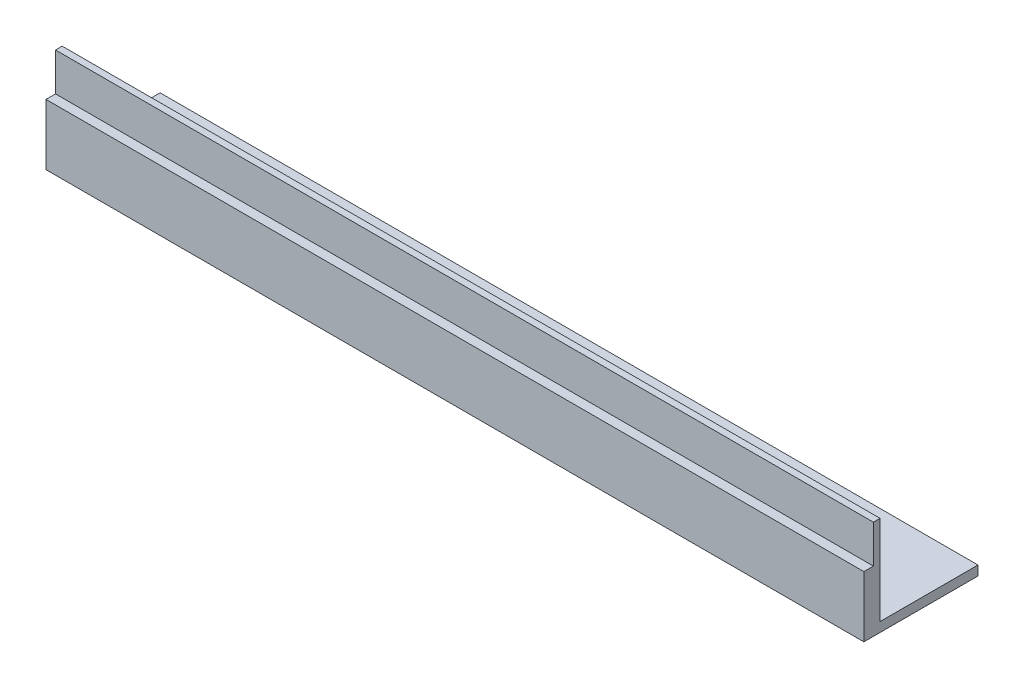
ISO-10303-21;
HEADER;
FILE_DESCRIPTION(('STEP AP214'),'2;1');
FILE_NAME('part.step','',(''),(''),'','','');
FILE_SCHEMA(('AUTOMOTIVE_DESIGN { 1 0 10303 214 1 1 1 1 }'));
ENDSEC;
DATA;
#1=APPLICATION_CONTEXT('core data for automotive mechanical design processes');
#2=APPLICATION_PROTOCOL_DEFINITION('international standard','automotive_design',2000,#1);
#3=PRODUCT_CONTEXT('',#1,'mechanical');
#4=PRODUCT('Part','Part','',(#3));
#5=PRODUCT_RELATED_PRODUCT_CATEGORY('part','',(#4));
#6=PRODUCT_DEFINITION_FORMATION('','',#4);
#7=PRODUCT_DEFINITION_CONTEXT('part definition',#1,'design');
#8=PRODUCT_DEFINITION('design','',#6,#7);
#9=PRODUCT_DEFINITION_SHAPE('','',#8);
#10=(LENGTH_UNIT() NAMED_UNIT(*) SI_UNIT(.MILLI.,.METRE.));
#11=(NAMED_UNIT(*) PLANE_ANGLE_UNIT() SI_UNIT($,.RADIAN.));
#12=(NAMED_UNIT(*) SI_UNIT($,.STERADIAN.) SOLID_ANGLE_UNIT());
#13=UNCERTAINTY_MEASURE_WITH_UNIT(LENGTH_MEASURE(1.E-05),#10,'distance_accuracy_value','');
#14=(GEOMETRIC_REPRESENTATION_CONTEXT(3) GLOBAL_UNCERTAINTY_ASSIGNED_CONTEXT((#13)) GLOBAL_UNIT_ASSIGNED_CONTEXT((#10,
#11,#12)) REPRESENTATION_CONTEXT('',''));
#15=CARTESIAN_POINT('',(0.,0.,0.));
#16=DIRECTION('',(0.,0.,1.));
#17=DIRECTION('',(1.,0.,0.));
#18=AXIS2_PLACEMENT_3D('',#15,#16,#17);
#19=CARTESIAN_POINT('',(215.,-14.25,0.));
#20=DIRECTION('',(0.,1.,0.));
#21=DIRECTION('',(0.,0.,1.));
#22=AXIS2_PLACEMENT_3D('',#19,#20,#21);
#23=PLANE('',#22);
#24=DIRECTION('',(0.,0.,-1.));
#25=VECTOR('',#24,1.);
#26=CARTESIAN_POINT('',(0.,-14.25,0.));
#27=LINE('',#26,#25);
#28=CARTESIAN_POINT('',(0.,-14.25,30.));
#29=VERTEX_POINT('',#28);
#30=CARTESIAN_POINT('',(0.,-14.25,0.));
#31=VERTEX_POINT('',#30);
#32=EDGE_CURVE('E135',#29,#31,#27,.T.);
#33=ORIENTED_EDGE('',*,*,#32,.T.);
#34=DIRECTION('',(-1.,0.,0.));
#35=VECTOR('',#34,1.);
#36=CARTESIAN_POINT('',(215.,-14.25,0.));
#37=LINE('',#36,#35);
#38=CARTESIAN_POINT('',(215.,-14.25,0.));
#39=VERTEX_POINT('',#38);
#40=EDGE_CURVE('E11',#39,#31,#37,.T.);
#41=ORIENTED_EDGE('',*,*,#40,.F.);
#42=DIRECTION('',(0.,0.,-1.));
#43=VECTOR('',#42,1.);
#44=CARTESIAN_POINT('',(215.,-14.25,0.));
#45=LINE('',#44,#43);
#46=CARTESIAN_POINT('',(215.,-14.25,30.));
#47=VERTEX_POINT('',#46);
#48=EDGE_CURVE('E155',#47,#39,#45,.T.);
#49=ORIENTED_EDGE('',*,*,#48,.F.);
#50=DIRECTION('',(-1.,0.,0.));
#51=VECTOR('',#50,1.);
#52=CARTESIAN_POINT('',(215.,-14.25,30.));
#53=LINE('',#52,#51);
#54=EDGE_CURVE('E55',#47,#29,#53,.T.);
#55=ORIENTED_EDGE('',*,*,#54,.T.);
#56=EDGE_LOOP('',(#33,#41,#49,#55));
#57=FACE_BOUND('',#56,.T.);
#58=ADVANCED_FACE('F39',(#57),#23,.F.);
#59=CARTESIAN_POINT('',(215.,0.,0.));
#60=DIRECTION('',(0.,0.,1.));
#61=DIRECTION('',(1.,0.,0.));
#62=AXIS2_PLACEMENT_3D('',#59,#60,#61);
#63=PLANE('',#62);
#64=DIRECTION('',(0.,1.,0.));
#65=VECTOR('',#64,1.);
#66=CARTESIAN_POINT('',(0.,0.,0.));
#67=LINE('',#66,#65);
#68=CARTESIAN_POINT('',(0.,-11.75,0.));
#69=VERTEX_POINT('',#68);
#70=EDGE_CURVE('E137',#31,#69,#67,.T.);
#71=ORIENTED_EDGE('',*,*,#70,.T.);
#72=DIRECTION('',(-1.,0.,0.));
#73=VECTOR('',#72,1.);
#74=CARTESIAN_POINT('',(215.,-11.75,0.));
#75=LINE('',#74,#73);
#76=CARTESIAN_POINT('',(215.,-11.75,0.));
#77=VERTEX_POINT('',#76);
#78=EDGE_CURVE('E47',#77,#69,#75,.T.);
#79=ORIENTED_EDGE('',*,*,#78,.F.);
#80=DIRECTION('',(0.,1.,0.));
#81=VECTOR('',#80,1.);
#82=CARTESIAN_POINT('',(215.,0.,0.));
#83=LINE('',#82,#81);
#84=EDGE_CURVE('E93',#39,#77,#83,.T.);
#85=ORIENTED_EDGE('',*,*,#84,.F.);
#86=ORIENTED_EDGE('',*,*,#40,.T.);
#87=EDGE_LOOP('',(#71,#79,#85,#86));
#88=FACE_BOUND('',#87,.T.);
#89=ADVANCED_FACE('F168',(#88),#63,.F.);
#90=CARTESIAN_POINT('',(215.,-11.75,0.));
#91=DIRECTION('',(0.,1.,0.));
#92=DIRECTION('',(0.,0.,1.));
#93=AXIS2_PLACEMENT_3D('',#90,#91,#92);
#94=PLANE('',#93);
#95=DIRECTION('',(0.,0.,-1.));
#96=VECTOR('',#95,1.);
#97=CARTESIAN_POINT('',(0.,-11.75,0.));
#98=LINE('',#97,#96);
#99=CARTESIAN_POINT('',(0.,-11.75,25.75));
#100=VERTEX_POINT('',#99);
#101=EDGE_CURVE('E140',#100,#69,#98,.T.);
#102=ORIENTED_EDGE('',*,*,#101,.F.);
#103=DIRECTION('',(-1.,0.,0.));
#104=VECTOR('',#103,1.);
#105=CARTESIAN_POINT('',(215.,-11.75,25.75));
#106=LINE('',#105,#104);
#107=CARTESIAN_POINT('',(215.,-11.75,25.75));
#108=VERTEX_POINT('',#107);
#109=EDGE_CURVE('E161',#108,#100,#106,.T.);
#110=ORIENTED_EDGE('',*,*,#109,.F.);
#111=DIRECTION('',(0.,0.,-1.));
#112=VECTOR('',#111,1.);
#113=CARTESIAN_POINT('',(215.,-11.75,0.));
#114=LINE('',#113,#112);
#115=EDGE_CURVE('E167',#108,#77,#114,.T.);
#116=ORIENTED_EDGE('',*,*,#115,.T.);
#117=ORIENTED_EDGE('',*,*,#78,.T.);
#118=EDGE_LOOP('',(#102,#110,#116,#117));
#119=FACE_BOUND('',#118,.T.);
#120=ADVANCED_FACE('F165',(#119),#94,.T.);
#121=CARTESIAN_POINT('',(215.,0.,25.75));
#122=DIRECTION('',(0.,0.,1.));
#123=DIRECTION('',(1.,0.,0.));
#124=AXIS2_PLACEMENT_3D('',#121,#122,#123);
#125=PLANE('',#124);
#126=DIRECTION('',(0.,1.,0.));
#127=VECTOR('',#126,1.);
#128=CARTESIAN_POINT('',(0.,0.,25.75));
#129=LINE('',#128,#127);
#130=CARTESIAN_POINT('',(0.,11.75,25.75));
#131=VERTEX_POINT('',#130);
#132=EDGE_CURVE('E143',#100,#131,#129,.T.);
#133=ORIENTED_EDGE('',*,*,#132,.T.);
#134=DIRECTION('',(-1.,0.,0.));
#135=VECTOR('',#134,1.);
#136=CARTESIAN_POINT('',(215.,11.75,25.75));
#137=LINE('',#136,#135);
#138=CARTESIAN_POINT('',(215.,11.75,25.75));
#139=VERTEX_POINT('',#138);
#140=EDGE_CURVE('E159',#139,#131,#137,.T.);
#141=ORIENTED_EDGE('',*,*,#140,.F.);
#142=DIRECTION('',(0.,1.,0.));
#143=VECTOR('',#142,1.);
#144=CARTESIAN_POINT('',(215.,0.,25.75));
#145=LINE('',#144,#143);
#146=EDGE_CURVE('E178',#108,#139,#145,.T.);
#147=ORIENTED_EDGE('',*,*,#146,.F.);
#148=ORIENTED_EDGE('',*,*,#109,.T.);
#149=EDGE_LOOP('',(#133,#141,#147,#148));
#150=FACE_BOUND('',#149,.T.);
#151=ADVANCED_FACE('F176',(#150),#125,.F.);
#152=CARTESIAN_POINT('',(215.,11.7500000000001,0.));
#153=DIRECTION('',(0.,1.,0.));
#154=DIRECTION('',(0.,0.,1.));
#155=AXIS2_PLACEMENT_3D('',#152,#153,#154);
#156=PLANE('',#155);
#157=DIRECTION('',(0.,0.,-1.));
#158=VECTOR('',#157,1.);
#159=CARTESIAN_POINT('',(0.,11.7500000000001,0.));
#160=LINE('',#159,#158);
#161=CARTESIAN_POINT('',(0.,11.75,27.5));
#162=VERTEX_POINT('',#161);
#163=EDGE_CURVE('E146',#162,#131,#160,.T.);
#164=ORIENTED_EDGE('',*,*,#163,.F.);
#165=DIRECTION('',(-1.,0.,0.));
#166=VECTOR('',#165,1.);
#167=CARTESIAN_POINT('',(215.,11.75,27.5));
#168=LINE('',#167,#166);
#169=CARTESIAN_POINT('',(215.,11.75,27.5));
#170=VERTEX_POINT('',#169);
#171=EDGE_CURVE('E118',#170,#162,#168,.T.);
#172=ORIENTED_EDGE('',*,*,#171,.F.);
#173=DIRECTION('',(0.,0.,-1.));
#174=VECTOR('',#173,1.);
#175=CARTESIAN_POINT('',(215.,11.7500000000001,0.));
#176=LINE('',#175,#174);
#177=EDGE_CURVE('E127',#170,#139,#176,.T.);
#178=ORIENTED_EDGE('',*,*,#177,.T.);
#179=ORIENTED_EDGE('',*,*,#140,.T.);
#180=EDGE_LOOP('',(#164,#172,#178,#179));
#181=FACE_BOUND('',#180,.T.);
#182=ADVANCED_FACE('F184',(#181),#156,.T.);
#183=CARTESIAN_POINT('',(215.,0.,27.5));
#184=DIRECTION('',(0.,0.,1.));
#185=DIRECTION('',(1.,0.,0.));
#186=AXIS2_PLACEMENT_3D('',#183,#184,#185);
#187=PLANE('',#186);
#188=DIRECTION('',(0.,1.,0.));
#189=VECTOR('',#188,1.);
#190=CARTESIAN_POINT('',(0.,0.,27.5));
#191=LINE('',#190,#189);
#192=CARTESIAN_POINT('',(0.,1.75,27.5));
#193=VERTEX_POINT('',#192);
#194=EDGE_CURVE('E114',#193,#162,#191,.T.);
#195=ORIENTED_EDGE('',*,*,#194,.F.);
#196=DIRECTION('',(-1.,0.,0.));
#197=VECTOR('',#196,1.);
#198=CARTESIAN_POINT('',(215.,1.75,27.5));
#199=LINE('',#198,#197);
#200=CARTESIAN_POINT('',(215.,1.75,27.5));
#201=VERTEX_POINT('',#200);
#202=EDGE_CURVE('E109',#201,#193,#199,.T.);
#203=ORIENTED_EDGE('',*,*,#202,.F.);
#204=DIRECTION('',(0.,1.,0.));
#205=VECTOR('',#204,1.);
#206=CARTESIAN_POINT('',(215.,0.,27.5));
#207=LINE('',#206,#205);
#208=EDGE_CURVE('E112',#201,#170,#207,.T.);
#209=ORIENTED_EDGE('',*,*,#208,.T.);
#210=ORIENTED_EDGE('',*,*,#171,.T.);
#211=EDGE_LOOP('',(#195,#203,#209,#210));
#212=FACE_BOUND('',#211,.T.);
#213=ADVANCED_FACE('F111',(#212),#187,.T.);
#214=CARTESIAN_POINT('',(215.,1.75,0.));
#215=DIRECTION('',(0.,1.,0.));
#216=DIRECTION('',(0.,0.,1.));
#217=AXIS2_PLACEMENT_3D('',#214,#215,#216);
#218=PLANE('',#217);
#219=DIRECTION('',(0.,0.,-1.));
#220=VECTOR('',#219,1.);
#221=CARTESIAN_POINT('',(0.,1.75,0.));
#222=LINE('',#221,#220);
#223=CARTESIAN_POINT('',(0.,1.75,30.));
#224=VERTEX_POINT('',#223);
#225=EDGE_CURVE('E150',#224,#193,#222,.T.);
#226=ORIENTED_EDGE('',*,*,#225,.F.);
#227=DIRECTION('',(-1.,0.,0.));
#228=VECTOR('',#227,1.);
#229=CARTESIAN_POINT('',(215.,1.75,30.));
#230=LINE('',#229,#228);
#231=CARTESIAN_POINT('',(215.,1.75,30.));
#232=VERTEX_POINT('',#231);
#233=EDGE_CURVE('E81',#232,#224,#230,.T.);
#234=ORIENTED_EDGE('',*,*,#233,.F.);
#235=DIRECTION('',(0.,0.,-1.));
#236=VECTOR('',#235,1.);
#237=CARTESIAN_POINT('',(215.,1.75,0.));
#238=LINE('',#237,#236);
#239=EDGE_CURVE('E125',#232,#201,#238,.T.);
#240=ORIENTED_EDGE('',*,*,#239,.T.);
#241=ORIENTED_EDGE('',*,*,#202,.T.);
#242=EDGE_LOOP('',(#226,#234,#240,#241));
#243=FACE_BOUND('',#242,.T.);
#244=ADVANCED_FACE('F129',(#243),#218,.T.);
#245=CARTESIAN_POINT('',(215.,0.,30.));
#246=DIRECTION('',(0.,0.,1.));
#247=DIRECTION('',(0.,-1.,0.));
#248=AXIS2_PLACEMENT_3D('',#245,#246,#247);
#249=PLANE('',#248);
#250=DIRECTION('',(0.,1.,0.));
#251=VECTOR('',#250,1.);
#252=CARTESIAN_POINT('',(0.,0.,30.));
#253=LINE('',#252,#251);
#254=EDGE_CURVE('E152',#29,#224,#253,.T.);
#255=ORIENTED_EDGE('',*,*,#254,.F.);
#256=ORIENTED_EDGE('',*,*,#54,.F.);
#257=DIRECTION('',(0.,1.,0.));
#258=VECTOR('',#257,1.);
#259=CARTESIAN_POINT('',(215.,0.,30.));
#260=LINE('',#259,#258);
#261=EDGE_CURVE('E130',#47,#232,#260,.T.);
#262=ORIENTED_EDGE('',*,*,#261,.T.);
#263=ORIENTED_EDGE('',*,*,#233,.T.);
#264=EDGE_LOOP('',(#255,#256,#262,#263));
#265=FACE_BOUND('',#264,.T.);
#266=ADVANCED_FACE('F185',(#265),#249,.T.);
#267=CARTESIAN_POINT('',(215.,0.,0.));
#268=DIRECTION('',(1.,0.,0.));
#269=DIRECTION('',(0.,0.,-1.));
#270=AXIS2_PLACEMENT_3D('',#267,#268,#269);
#271=PLANE('',#270);
#272=ORIENTED_EDGE('',*,*,#48,.T.);
#273=ORIENTED_EDGE('',*,*,#84,.T.);
#274=ORIENTED_EDGE('',*,*,#115,.F.);
#275=ORIENTED_EDGE('',*,*,#146,.T.);
#276=ORIENTED_EDGE('',*,*,#177,.F.);
#277=ORIENTED_EDGE('',*,*,#208,.F.);
#278=ORIENTED_EDGE('',*,*,#239,.F.);
#279=ORIENTED_EDGE('',*,*,#261,.F.);
#280=EDGE_LOOP('',(#272,#273,#274,#275,#276,#277,#278,#279));
#281=FACE_BOUND('',#280,.T.);
#282=ADVANCED_FACE('F123',(#281),#271,.T.);
#283=CARTESIAN_POINT('',(0.,0.,0.));
#284=DIRECTION('',(1.,0.,0.));
#285=DIRECTION('',(0.,0.,-1.));
#286=AXIS2_PLACEMENT_3D('',#283,#284,#285);
#287=PLANE('',#286);
#288=ORIENTED_EDGE('',*,*,#32,.F.);
#289=ORIENTED_EDGE('',*,*,#254,.T.);
#290=ORIENTED_EDGE('',*,*,#225,.T.);
#291=ORIENTED_EDGE('',*,*,#194,.T.);
#292=ORIENTED_EDGE('',*,*,#163,.T.);
#293=ORIENTED_EDGE('',*,*,#132,.F.);
#294=ORIENTED_EDGE('',*,*,#101,.T.);
#295=ORIENTED_EDGE('',*,*,#70,.F.);
#296=EDGE_LOOP('',(#288,#289,#290,#291,#292,#293,#294,#295));
#297=FACE_BOUND('',#296,.T.);
#298=ADVANCED_FACE('F172',(#297),#287,.F.);
#299=CLOSED_SHELL('',(#58,#89,#120,#151,#182,#213,#244,#266,#282,#298));
#300=MANIFOLD_SOLID_BREP('B2',#299);
#301=ADVANCED_BREP_SHAPE_REPRESENTATION('',(#18,#300),#14);
#302=SHAPE_DEFINITION_REPRESENTATION(#9,#301);
ENDSEC;
END-ISO-10303-21;
